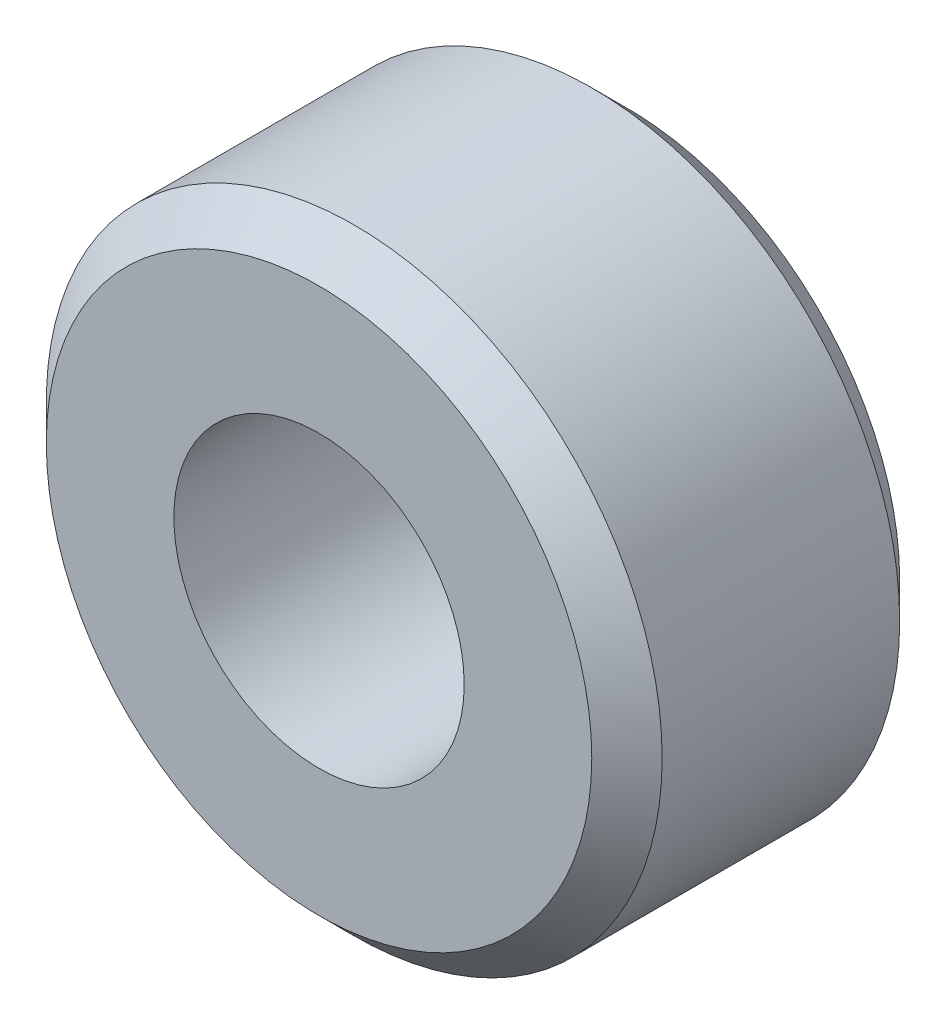
ISO-10303-21;
HEADER;
FILE_DESCRIPTION(('STEP AP214'),'2;1');
FILE_NAME('part.step','',(''),(''),'','','');
FILE_SCHEMA(('AUTOMOTIVE_DESIGN { 1 0 10303 214 1 1 1 1 }'));
ENDSEC;
DATA;
#1=APPLICATION_CONTEXT('core data for automotive mechanical design processes');
#2=APPLICATION_PROTOCOL_DEFINITION('international standard','automotive_design',2000,#1);
#3=PRODUCT_CONTEXT('',#1,'mechanical');
#4=PRODUCT('Part','Part','',(#3));
#5=PRODUCT_RELATED_PRODUCT_CATEGORY('part','',(#4));
#6=PRODUCT_DEFINITION_FORMATION('','',#4);
#7=PRODUCT_DEFINITION_CONTEXT('part definition',#1,'design');
#8=PRODUCT_DEFINITION('design','',#6,#7);
#9=PRODUCT_DEFINITION_SHAPE('','',#8);
#10=(LENGTH_UNIT() NAMED_UNIT(*) SI_UNIT(.MILLI.,.METRE.));
#11=(NAMED_UNIT(*) PLANE_ANGLE_UNIT() SI_UNIT($,.RADIAN.));
#12=(NAMED_UNIT(*) SI_UNIT($,.STERADIAN.) SOLID_ANGLE_UNIT());
#13=UNCERTAINTY_MEASURE_WITH_UNIT(LENGTH_MEASURE(1.E-05),#10,'distance_accuracy_value','');
#14=(GEOMETRIC_REPRESENTATION_CONTEXT(3) GLOBAL_UNCERTAINTY_ASSIGNED_CONTEXT((#13)) GLOBAL_UNIT_ASSIGNED_CONTEXT((#10,
#11,#12)) REPRESENTATION_CONTEXT('',''));
#15=CARTESIAN_POINT('',(0.,0.,0.));
#16=DIRECTION('',(0.,0.,1.));
#17=DIRECTION('',(1.,0.,0.));
#18=AXIS2_PLACEMENT_3D('',#15,#16,#17);
#19=CARTESIAN_POINT('',(0.,0.,3.5));
#20=DIRECTION('',(0.,0.,1.));
#21=DIRECTION('',(1.,0.,0.));
#22=AXIS2_PLACEMENT_3D('',#19,#20,#21);
#23=PLANE('',#22);
#24=CARTESIAN_POINT('',(0.,0.,3.5));
#25=DIRECTION('',(0.,0.,1.));
#26=DIRECTION('',(1.,0.,0.));
#27=AXIS2_PLACEMENT_3D('',#24,#25,#26);
#28=CIRCLE('',#27,3.1);
#29=CARTESIAN_POINT('',(3.1,0.,3.5));
#30=VERTEX_POINT('',#29);
#31=EDGE_CURVE('E57',#30,#30,#28,.T.);
#32=ORIENTED_EDGE('',*,*,#31,.T.);
#33=EDGE_LOOP('',(#32));
#34=FACE_BOUND('',#33,.T.);
#35=CARTESIAN_POINT('',(0.,0.,3.5));
#36=DIRECTION('',(0.,0.,1.));
#37=DIRECTION('',(1.,0.,0.));
#38=AXIS2_PLACEMENT_3D('',#35,#36,#37);
#39=CIRCLE('',#38,1.65);
#40=CARTESIAN_POINT('',(1.65,0.,3.5));
#41=VERTEX_POINT('',#40);
#42=EDGE_CURVE('E62',#41,#41,#39,.T.);
#43=ORIENTED_EDGE('',*,*,#42,.F.);
#44=EDGE_LOOP('',(#43));
#45=FACE_BOUND('',#44,.T.);
#46=ADVANCED_FACE('F41',(#34,#45),#23,.T.);
#47=CARTESIAN_POINT('',(0.,0.,0.));
#48=DIRECTION('',(0.,0.,1.));
#49=DIRECTION('',(1.,0.,0.));
#50=AXIS2_PLACEMENT_3D('',#47,#48,#49);
#51=PLANE('',#50);
#52=CARTESIAN_POINT('',(0.,0.,0.));
#53=DIRECTION('',(0.,0.,1.));
#54=DIRECTION('',(1.,0.,0.));
#55=AXIS2_PLACEMENT_3D('',#52,#53,#54);
#56=CIRCLE('',#55,3.1);
#57=CARTESIAN_POINT('',(3.1,0.,0.));
#58=VERTEX_POINT('',#57);
#59=EDGE_CURVE('E10',#58,#58,#56,.F.);
#60=ORIENTED_EDGE('',*,*,#59,.T.);
#61=EDGE_LOOP('',(#60));
#62=FACE_BOUND('',#61,.T.);
#63=CARTESIAN_POINT('',(0.,0.,0.));
#64=DIRECTION('',(0.,0.,1.));
#65=DIRECTION('',(1.,0.,0.));
#66=AXIS2_PLACEMENT_3D('',#63,#64,#65);
#67=CIRCLE('',#66,1.65);
#68=CARTESIAN_POINT('',(1.65,0.,0.));
#69=VERTEX_POINT('',#68);
#70=EDGE_CURVE('E63',#69,#69,#67,.T.);
#71=ORIENTED_EDGE('',*,*,#70,.T.);
#72=EDGE_LOOP('',(#71));
#73=FACE_BOUND('',#72,.T.);
#74=ADVANCED_FACE('F73',(#62,#73),#51,.F.);
#75=CARTESIAN_POINT('',(0.,0.,3.5));
#76=DIRECTION('',(0.,0.,-1.));
#77=DIRECTION('',(-1.,0.,0.));
#78=AXIS2_PLACEMENT_3D('',#75,#76,#77);
#79=CYLINDRICAL_SURFACE('',#78,3.5);
#80=CARTESIAN_POINT('',(0.,0.,3.1));
#81=DIRECTION('',(0.,0.,1.));
#82=DIRECTION('',(1.,0.,0.));
#83=AXIS2_PLACEMENT_3D('',#80,#81,#82);
#84=CIRCLE('',#83,3.5);
#85=CARTESIAN_POINT('',(3.5,0.,3.1));
#86=VERTEX_POINT('',#85);
#87=EDGE_CURVE('E49',#86,#86,#84,.F.);
#88=ORIENTED_EDGE('',*,*,#87,.T.);
#89=EDGE_LOOP('',(#88));
#90=FACE_BOUND('',#89,.T.);
#91=CARTESIAN_POINT('',(0.,0.,0.399999999999998));
#92=DIRECTION('',(0.,0.,1.));
#93=DIRECTION('',(1.,0.,0.));
#94=AXIS2_PLACEMENT_3D('',#91,#92,#93);
#95=CIRCLE('',#94,3.5);
#96=CARTESIAN_POINT('',(3.5,0.,0.399999999999998));
#97=VERTEX_POINT('',#96);
#98=EDGE_CURVE('E53',#97,#97,#95,.T.);
#99=ORIENTED_EDGE('',*,*,#98,.T.);
#100=EDGE_LOOP('',(#99));
#101=FACE_BOUND('',#100,.T.);
#102=ADVANCED_FACE('F80',(#90,#101),#79,.T.);
#103=CARTESIAN_POINT('',(0.,0.,3.5));
#104=DIRECTION('',(0.,0.,-1.));
#105=DIRECTION('',(-1.,0.,0.));
#106=AXIS2_PLACEMENT_3D('',#103,#104,#105);
#107=CYLINDRICAL_SURFACE('',#106,1.65);
#108=ORIENTED_EDGE('',*,*,#42,.T.);
#109=EDGE_LOOP('',(#108));
#110=FACE_BOUND('',#109,.T.);
#111=ORIENTED_EDGE('',*,*,#70,.F.);
#112=EDGE_LOOP('',(#111));
#113=FACE_BOUND('',#112,.T.);
#114=ADVANCED_FACE('F69',(#110,#113),#107,.F.);
#115=CARTESIAN_POINT('',(0.,0.,3.5));
#116=DIRECTION('',(0.,0.,-1.));
#117=DIRECTION('',(-1.,0.,0.));
#118=AXIS2_PLACEMENT_3D('',#115,#116,#117);
#119=CONICAL_SURFACE('',#118,3.1,0.785398163397448);
#120=ORIENTED_EDGE('',*,*,#87,.F.);
#121=EDGE_LOOP('',(#120));
#122=FACE_BOUND('',#121,.T.);
#123=ORIENTED_EDGE('',*,*,#31,.F.);
#124=EDGE_LOOP('',(#123));
#125=FACE_BOUND('',#124,.T.);
#126=ADVANCED_FACE('F86',(#122,#125),#119,.T.);
#127=CARTESIAN_POINT('',(0.,0.,0.399999999999998));
#128=DIRECTION('',(0.,0.,1.));
#129=DIRECTION('',(1.,0.,0.));
#130=AXIS2_PLACEMENT_3D('',#127,#128,#129);
#131=CONICAL_SURFACE('',#130,3.5,0.78539816339745);
#132=ORIENTED_EDGE('',*,*,#59,.F.);
#133=EDGE_LOOP('',(#132));
#134=FACE_BOUND('',#133,.T.);
#135=ORIENTED_EDGE('',*,*,#98,.F.);
#136=EDGE_LOOP('',(#135));
#137=FACE_BOUND('',#136,.T.);
#138=ADVANCED_FACE('F44',(#134,#137),#131,.T.);
#139=CLOSED_SHELL('',(#46,#74,#102,#114,#126,#138));
#140=MANIFOLD_SOLID_BREP('B2',#139);
#141=ADVANCED_BREP_SHAPE_REPRESENTATION('',(#18,#140),#14);
#142=SHAPE_DEFINITION_REPRESENTATION(#9,#141);
ENDSEC;
END-ISO-10303-21;
